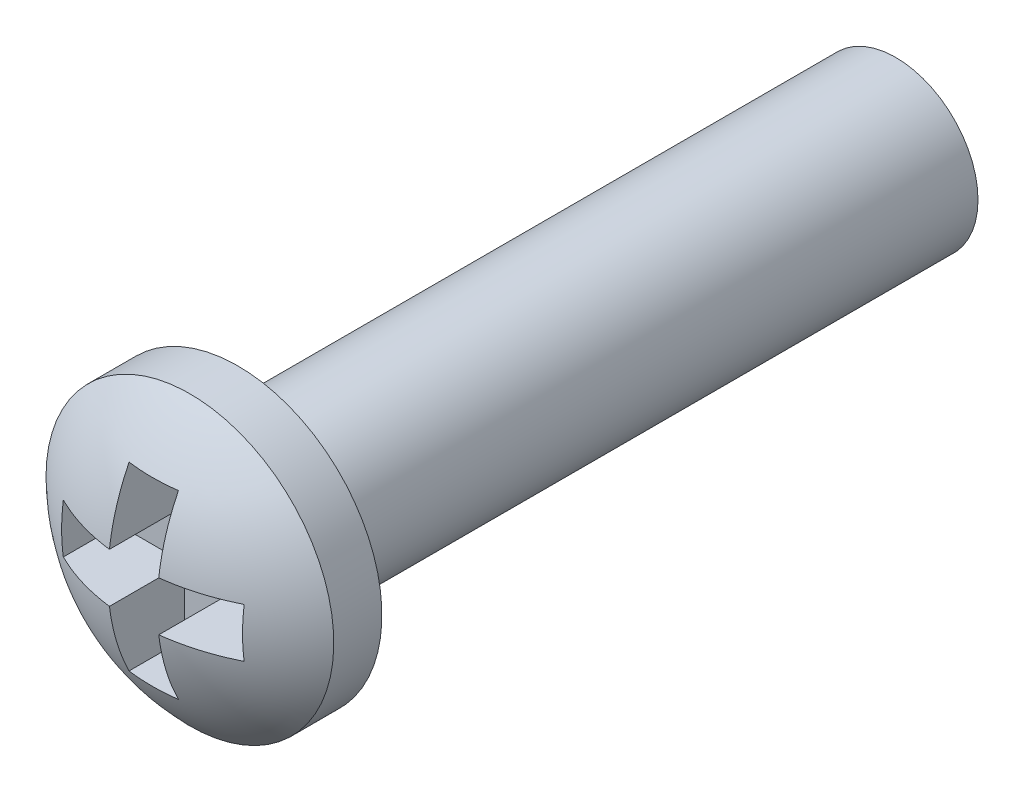
ISO-10303-21;
HEADER;
FILE_DESCRIPTION(('STEP AP214'),'2;1');
FILE_NAME('part.step','',(''),(''),'','','');
FILE_SCHEMA(('AUTOMOTIVE_DESIGN { 1 0 10303 214 1 1 1 1 }'));
ENDSEC;
DATA;
#1=APPLICATION_CONTEXT('core data for automotive mechanical design processes');
#2=APPLICATION_PROTOCOL_DEFINITION('international standard','automotive_design',2000,#1);
#3=PRODUCT_CONTEXT('',#1,'mechanical');
#4=PRODUCT('Part','Part','',(#3));
#5=PRODUCT_RELATED_PRODUCT_CATEGORY('part','',(#4));
#6=PRODUCT_DEFINITION_FORMATION('','',#4);
#7=PRODUCT_DEFINITION_CONTEXT('part definition',#1,'design');
#8=PRODUCT_DEFINITION('design','',#6,#7);
#9=PRODUCT_DEFINITION_SHAPE('','',#8);
#10=(LENGTH_UNIT() NAMED_UNIT(*) SI_UNIT(.MILLI.,.METRE.));
#11=(NAMED_UNIT(*) PLANE_ANGLE_UNIT() SI_UNIT($,.RADIAN.));
#12=(NAMED_UNIT(*) SI_UNIT($,.STERADIAN.) SOLID_ANGLE_UNIT());
#13=UNCERTAINTY_MEASURE_WITH_UNIT(LENGTH_MEASURE(1.E-05),#10,'distance_accuracy_value','');
#14=(GEOMETRIC_REPRESENTATION_CONTEXT(3) GLOBAL_UNCERTAINTY_ASSIGNED_CONTEXT((#13)) GLOBAL_UNIT_ASSIGNED_CONTEXT((#10,
#11,#12)) REPRESENTATION_CONTEXT('',''));
#15=CARTESIAN_POINT('',(0.,0.,0.));
#16=DIRECTION('',(0.,0.,1.));
#17=DIRECTION('',(1.,0.,0.));
#18=AXIS2_PLACEMENT_3D('',#15,#16,#17);
#19=CARTESIAN_POINT('',(0.,0.,-8.));
#20=DIRECTION('',(0.,0.,1.));
#21=DIRECTION('',(1.,0.,0.));
#22=AXIS2_PLACEMENT_3D('',#19,#20,#21);
#23=CYLINDRICAL_SURFACE('',#22,1.);
#24=CARTESIAN_POINT('',(0.,0.,-8.));
#25=DIRECTION('',(0.,0.,1.));
#26=DIRECTION('',(1.,0.,0.));
#27=AXIS2_PLACEMENT_3D('',#24,#25,#26);
#28=CIRCLE('',#27,1.);
#29=CARTESIAN_POINT('',(1.,0.,-8.));
#30=VERTEX_POINT('',#29);
#31=EDGE_CURVE('E212',#30,#30,#28,.T.);
#32=ORIENTED_EDGE('',*,*,#31,.T.);
#33=EDGE_LOOP('',(#32));
#34=FACE_BOUND('',#33,.T.);
#35=CARTESIAN_POINT('',(0.,0.,0.));
#36=DIRECTION('',(0.,0.,1.));
#37=DIRECTION('',(1.,0.,0.));
#38=AXIS2_PLACEMENT_3D('',#35,#36,#37);
#39=CIRCLE('',#38,1.);
#40=CARTESIAN_POINT('',(1.,0.,0.));
#41=VERTEX_POINT('',#40);
#42=EDGE_CURVE('E208',#41,#41,#39,.T.);
#43=ORIENTED_EDGE('',*,*,#42,.F.);
#44=EDGE_LOOP('',(#43));
#45=FACE_BOUND('',#44,.T.);
#46=ADVANCED_FACE('F41',(#34,#45),#23,.T.);
#47=CARTESIAN_POINT('',(0.,0.,-8.));
#48=DIRECTION('',(0.,0.,1.));
#49=DIRECTION('',(1.,0.,0.));
#50=AXIS2_PLACEMENT_3D('',#47,#48,#49);
#51=PLANE('',#50);
#52=ORIENTED_EDGE('',*,*,#31,.F.);
#53=EDGE_LOOP('',(#52));
#54=FACE_BOUND('',#53,.T.);
#55=ADVANCED_FACE('F281',(#54),#51,.F.);
#56=CARTESIAN_POINT('',(0.,0.,0.));
#57=DIRECTION('',(0.,0.,1.));
#58=DIRECTION('',(1.,0.,0.));
#59=AXIS2_PLACEMENT_3D('',#56,#57,#58);
#60=PLANE('',#59);
#61=ORIENTED_EDGE('',*,*,#42,.T.);
#62=EDGE_LOOP('',(#61));
#63=FACE_BOUND('',#62,.T.);
#64=CARTESIAN_POINT('',(0.,0.,0.));
#65=DIRECTION('',(0.,0.,-1.));
#66=DIRECTION('',(-1.,0.,0.));
#67=AXIS2_PLACEMENT_3D('',#64,#65,#66);
#68=CIRCLE('',#67,1.75);
#69=CARTESIAN_POINT('',(-1.75,0.,0.));
#70=VERTEX_POINT('',#69);
#71=EDGE_CURVE('E210',#70,#70,#68,.T.);
#72=ORIENTED_EDGE('',*,*,#71,.T.);
#73=EDGE_LOOP('',(#72));
#74=FACE_BOUND('',#73,.T.);
#75=ADVANCED_FACE('F286',(#63,#74),#60,.F.);
#76=CARTESIAN_POINT('',(0.,0.,-2.));
#77=DIRECTION('',(0.,0.,-1.));
#78=DIRECTION('',(-1.,0.,0.));
#79=AXIS2_PLACEMENT_3D('',#76,#77,#78);
#80=CYLINDRICAL_SURFACE('',#79,1.75);
#81=ORIENTED_EDGE('',*,*,#71,.F.);
#82=EDGE_LOOP('',(#81));
#83=FACE_BOUND('',#82,.T.);
#84=CARTESIAN_POINT('',(0.,0.,0.585357107135713));
#85=DIRECTION('',(0.,0.,-1.));
#86=DIRECTION('',(-1.,0.,0.));
#87=AXIS2_PLACEMENT_3D('',#84,#85,#86);
#88=CIRCLE('',#87,1.75);
#89=CARTESIAN_POINT('',(-1.75,0.,0.585357107135713));
#90=VERTEX_POINT('',#89);
#91=EDGE_CURVE('E179',#90,#90,#88,.T.);
#92=ORIENTED_EDGE('',*,*,#91,.T.);
#93=EDGE_LOOP('',(#92));
#94=FACE_BOUND('',#93,.T.);
#95=ADVANCED_FACE('F300',(#83,#94),#80,.T.);
#96=CARTESIAN_POINT('',(0.,0.,-1.2));
#97=DIRECTION('',(0.,0.,-1.));
#98=DIRECTION('',(1.,0.,0.));
#99=AXIS2_PLACEMENT_3D('',#96,#97,#98);
#100=SPHERICAL_SURFACE('',#99,2.5);
#101=CARTESIAN_POINT('',(0.,-1.1,-1.2));
#102=DIRECTION('',(0.,-1.,0.));
#103=DIRECTION('',(0.,0.,-1.));
#104=AXIS2_PLACEMENT_3D('',#101,#102,#103);
#105=CIRCLE('',#104,2.24499443206437);
#106=CARTESIAN_POINT('',(0.3,-1.1,1.0248595461287));
#107=VERTEX_POINT('',#106);
#108=CARTESIAN_POINT('',(-0.3,-1.1,1.0248595461287));
#109=VERTEX_POINT('',#108);
#110=EDGE_CURVE('E211',#107,#109,#105,.T.);
#111=ORIENTED_EDGE('',*,*,#110,.T.);
#112=CARTESIAN_POINT('',(-0.3,0.,-1.2));
#113=DIRECTION('',(-1.,0.,0.));
#114=DIRECTION('',(0.,0.,1.));
#115=AXIS2_PLACEMENT_3D('',#112,#113,#114);
#116=CIRCLE('',#115,2.48193472919818);
#117=CARTESIAN_POINT('',(-0.3,-0.3,1.26373699895098));
#118=VERTEX_POINT('',#117);
#119=EDGE_CURVE('E11',#109,#118,#116,.T.);
#120=ORIENTED_EDGE('',*,*,#119,.T.);
#121=CARTESIAN_POINT('',(0.,-0.3,-1.2));
#122=DIRECTION('',(0.,-1.,0.));
#123=DIRECTION('',(0.,0.,-1.));
#124=AXIS2_PLACEMENT_3D('',#121,#122,#123);
#125=CIRCLE('',#124,2.48193472919818);
#126=CARTESIAN_POINT('',(-1.1,-0.3,1.0248595461287));
#127=VERTEX_POINT('',#126);
#128=EDGE_CURVE('E48',#118,#127,#125,.T.);
#129=ORIENTED_EDGE('',*,*,#128,.T.);
#130=CARTESIAN_POINT('',(-1.1,0.,-1.2));
#131=DIRECTION('',(-1.,0.,0.));
#132=DIRECTION('',(0.,0.,1.));
#133=AXIS2_PLACEMENT_3D('',#130,#131,#132);
#134=CIRCLE('',#133,2.24499443206437);
#135=CARTESIAN_POINT('',(-1.1,0.3,1.0248595461287));
#136=VERTEX_POINT('',#135);
#137=EDGE_CURVE('E245',#127,#136,#134,.T.);
#138=ORIENTED_EDGE('',*,*,#137,.T.);
#139=CARTESIAN_POINT('',(0.,0.3,-1.2));
#140=DIRECTION('',(0.,1.,0.));
#141=DIRECTION('',(0.,0.,1.));
#142=AXIS2_PLACEMENT_3D('',#139,#140,#141);
#143=CIRCLE('',#142,2.48193472919818);
#144=CARTESIAN_POINT('',(-0.3,0.3,1.26373699895098));
#145=VERTEX_POINT('',#144);
#146=EDGE_CURVE('E236',#136,#145,#143,.T.);
#147=ORIENTED_EDGE('',*,*,#146,.T.);
#148=CARTESIAN_POINT('',(-0.3,0.,-1.2));
#149=DIRECTION('',(-1.,0.,0.));
#150=DIRECTION('',(0.,0.,1.));
#151=AXIS2_PLACEMENT_3D('',#148,#149,#150);
#152=CIRCLE('',#151,2.48193472919818);
#153=CARTESIAN_POINT('',(-0.3,1.1,1.0248595461287));
#154=VERTEX_POINT('',#153);
#155=EDGE_CURVE('E237',#145,#154,#152,.T.);
#156=ORIENTED_EDGE('',*,*,#155,.T.);
#157=CARTESIAN_POINT('',(0.,1.1,-1.2));
#158=DIRECTION('',(0.,1.,0.));
#159=DIRECTION('',(0.,0.,1.));
#160=AXIS2_PLACEMENT_3D('',#157,#158,#159);
#161=CIRCLE('',#160,2.24499443206437);
#162=CARTESIAN_POINT('',(0.3,1.1,1.0248595461287));
#163=VERTEX_POINT('',#162);
#164=EDGE_CURVE('E231',#154,#163,#161,.T.);
#165=ORIENTED_EDGE('',*,*,#164,.T.);
#166=CARTESIAN_POINT('',(0.3,0.,-1.2));
#167=DIRECTION('',(1.,0.,0.));
#168=DIRECTION('',(0.,0.,-1.));
#169=AXIS2_PLACEMENT_3D('',#166,#167,#168);
#170=CIRCLE('',#169,2.48193472919818);
#171=CARTESIAN_POINT('',(0.3,0.3,1.26373699895098));
#172=VERTEX_POINT('',#171);
#173=EDGE_CURVE('E226',#163,#172,#170,.T.);
#174=ORIENTED_EDGE('',*,*,#173,.T.);
#175=CARTESIAN_POINT('',(0.,0.3,-1.2));
#176=DIRECTION('',(0.,1.,0.));
#177=DIRECTION('',(0.,0.,1.));
#178=AXIS2_PLACEMENT_3D('',#175,#176,#177);
#179=CIRCLE('',#178,2.48193472919818);
#180=CARTESIAN_POINT('',(1.1,0.3,1.0248595461287));
#181=VERTEX_POINT('',#180);
#182=EDGE_CURVE('E229',#172,#181,#179,.T.);
#183=ORIENTED_EDGE('',*,*,#182,.T.);
#184=CARTESIAN_POINT('',(1.1,0.,-1.2));
#185=DIRECTION('',(1.,0.,0.));
#186=DIRECTION('',(0.,0.,-1.));
#187=AXIS2_PLACEMENT_3D('',#184,#185,#186);
#188=CIRCLE('',#187,2.24499443206437);
#189=CARTESIAN_POINT('',(1.1,-0.3,1.0248595461287));
#190=VERTEX_POINT('',#189);
#191=EDGE_CURVE('E221',#181,#190,#188,.T.);
#192=ORIENTED_EDGE('',*,*,#191,.T.);
#193=CARTESIAN_POINT('',(0.,-0.3,-1.2));
#194=DIRECTION('',(0.,-1.,0.));
#195=DIRECTION('',(0.,0.,-1.));
#196=AXIS2_PLACEMENT_3D('',#193,#194,#195);
#197=CIRCLE('',#196,2.48193472919818);
#198=CARTESIAN_POINT('',(0.3,-0.3,1.26373699895098));
#199=VERTEX_POINT('',#198);
#200=EDGE_CURVE('E222',#190,#199,#197,.T.);
#201=ORIENTED_EDGE('',*,*,#200,.T.);
#202=CARTESIAN_POINT('',(0.3,0.,-1.2));
#203=DIRECTION('',(1.,0.,0.));
#204=DIRECTION('',(0.,0.,-1.));
#205=AXIS2_PLACEMENT_3D('',#202,#203,#204);
#206=CIRCLE('',#205,2.48193472919818);
#207=EDGE_CURVE('E219',#199,#107,#206,.T.);
#208=ORIENTED_EDGE('',*,*,#207,.T.);
#209=EDGE_LOOP('',(#111,#120,#129,#138,#147,#156,#165,#174,#183,#192,#201,#208));
#210=FACE_BOUND('',#209,.T.);
#211=ORIENTED_EDGE('',*,*,#91,.F.);
#212=EDGE_LOOP('',(#211));
#213=FACE_BOUND('',#212,.T.);
#214=ADVANCED_FACE('F243',(#210,#213),#100,.T.);
#215=CARTESIAN_POINT('',(-0.3,-0.3,0.35));
#216=DIRECTION('',(-1.,0.,0.));
#217=DIRECTION('',(0.,0.,1.));
#218=AXIS2_PLACEMENT_3D('',#215,#216,#217);
#219=PLANE('',#218);
#220=DIRECTION('',(0.,0.,1.));
#221=VECTOR('',#220,1.);
#222=CARTESIAN_POINT('',(-0.3,-1.1,0.35));
#223=LINE('',#222,#221);
#224=CARTESIAN_POINT('',(-0.3,-1.1,0.35));
#225=VERTEX_POINT('',#224);
#226=EDGE_CURVE('E54',#225,#109,#223,.T.);
#227=ORIENTED_EDGE('',*,*,#226,.F.);
#228=DIRECTION('',(0.,-1.,0.));
#229=VECTOR('',#228,1.);
#230=CARTESIAN_POINT('',(-0.3,-0.3,0.35));
#231=LINE('',#230,#229);
#232=CARTESIAN_POINT('',(-0.3,-0.3,0.35));
#233=VERTEX_POINT('',#232);
#234=EDGE_CURVE('E129',#233,#225,#231,.T.);
#235=ORIENTED_EDGE('',*,*,#234,.F.);
#236=DIRECTION('',(0.,0.,1.));
#237=VECTOR('',#236,1.);
#238=CARTESIAN_POINT('',(-0.3,-0.3,0.35));
#239=LINE('',#238,#237);
#240=EDGE_CURVE('E173',#233,#118,#239,.T.);
#241=ORIENTED_EDGE('',*,*,#240,.T.);
#242=ORIENTED_EDGE('',*,*,#119,.F.);
#243=EDGE_LOOP('',(#227,#235,#241,#242));
#244=FACE_BOUND('',#243,.T.);
#245=ADVANCED_FACE('F127',(#244),#219,.F.);
#246=CARTESIAN_POINT('',(-1.1,-0.3,0.35));
#247=DIRECTION('',(0.,-1.,0.));
#248=DIRECTION('',(0.,0.,-1.));
#249=AXIS2_PLACEMENT_3D('',#246,#247,#248);
#250=PLANE('',#249);
#251=ORIENTED_EDGE('',*,*,#240,.F.);
#252=DIRECTION('',(1.,0.,0.));
#253=VECTOR('',#252,1.);
#254=CARTESIAN_POINT('',(-1.1,-0.3,0.35));
#255=LINE('',#254,#253);
#256=CARTESIAN_POINT('',(-1.1,-0.3,0.35));
#257=VERTEX_POINT('',#256);
#258=EDGE_CURVE('E131',#257,#233,#255,.T.);
#259=ORIENTED_EDGE('',*,*,#258,.F.);
#260=DIRECTION('',(0.,0.,1.));
#261=VECTOR('',#260,1.);
#262=CARTESIAN_POINT('',(-1.1,-0.3,0.35));
#263=LINE('',#262,#261);
#264=EDGE_CURVE('E177',#257,#127,#263,.T.);
#265=ORIENTED_EDGE('',*,*,#264,.T.);
#266=ORIENTED_EDGE('',*,*,#128,.F.);
#267=EDGE_LOOP('',(#251,#259,#265,#266));
#268=FACE_BOUND('',#267,.T.);
#269=ADVANCED_FACE('F273',(#268),#250,.F.);
#270=CARTESIAN_POINT('',(-1.1,0.3,0.35));
#271=DIRECTION('',(-1.,0.,0.));
#272=DIRECTION('',(0.,0.,1.));
#273=AXIS2_PLACEMENT_3D('',#270,#271,#272);
#274=PLANE('',#273);
#275=ORIENTED_EDGE('',*,*,#264,.F.);
#276=DIRECTION('',(0.,-1.,0.));
#277=VECTOR('',#276,1.);
#278=CARTESIAN_POINT('',(-1.1,0.3,0.35));
#279=LINE('',#278,#277);
#280=CARTESIAN_POINT('',(-1.1,0.3,0.35));
#281=VERTEX_POINT('',#280);
#282=EDGE_CURVE('E175',#281,#257,#279,.T.);
#283=ORIENTED_EDGE('',*,*,#282,.F.);
#284=DIRECTION('',(0.,0.,1.));
#285=VECTOR('',#284,1.);
#286=CARTESIAN_POINT('',(-1.1,0.3,0.35));
#287=LINE('',#286,#285);
#288=EDGE_CURVE('E176',#281,#136,#287,.T.);
#289=ORIENTED_EDGE('',*,*,#288,.T.);
#290=ORIENTED_EDGE('',*,*,#137,.F.);
#291=EDGE_LOOP('',(#275,#283,#289,#290));
#292=FACE_BOUND('',#291,.T.);
#293=ADVANCED_FACE('F275',(#292),#274,.F.);
#294=CARTESIAN_POINT('',(-0.3,0.3,0.35));
#295=DIRECTION('',(0.,1.,0.));
#296=DIRECTION('',(0.,0.,1.));
#297=AXIS2_PLACEMENT_3D('',#294,#295,#296);
#298=PLANE('',#297);
#299=ORIENTED_EDGE('',*,*,#288,.F.);
#300=DIRECTION('',(-1.,0.,0.));
#301=VECTOR('',#300,1.);
#302=CARTESIAN_POINT('',(-0.3,0.3,0.35));
#303=LINE('',#302,#301);
#304=CARTESIAN_POINT('',(-0.3,0.3,0.35));
#305=VERTEX_POINT('',#304);
#306=EDGE_CURVE('E166',#305,#281,#303,.T.);
#307=ORIENTED_EDGE('',*,*,#306,.F.);
#308=DIRECTION('',(0.,0.,1.));
#309=VECTOR('',#308,1.);
#310=CARTESIAN_POINT('',(-0.3,0.3,0.35));
#311=LINE('',#310,#309);
#312=EDGE_CURVE('E181',#305,#145,#311,.T.);
#313=ORIENTED_EDGE('',*,*,#312,.T.);
#314=ORIENTED_EDGE('',*,*,#146,.F.);
#315=EDGE_LOOP('',(#299,#307,#313,#314));
#316=FACE_BOUND('',#315,.T.);
#317=ADVANCED_FACE('F269',(#316),#298,.F.);
#318=CARTESIAN_POINT('',(-0.3,1.1,0.35));
#319=DIRECTION('',(-1.,0.,0.));
#320=DIRECTION('',(0.,0.,1.));
#321=AXIS2_PLACEMENT_3D('',#318,#319,#320);
#322=PLANE('',#321);
#323=ORIENTED_EDGE('',*,*,#312,.F.);
#324=DIRECTION('',(0.,-1.,0.));
#325=VECTOR('',#324,1.);
#326=CARTESIAN_POINT('',(-0.3,1.1,0.35));
#327=LINE('',#326,#325);
#328=CARTESIAN_POINT('',(-0.3,1.1,0.35));
#329=VERTEX_POINT('',#328);
#330=EDGE_CURVE('E167',#329,#305,#327,.T.);
#331=ORIENTED_EDGE('',*,*,#330,.F.);
#332=DIRECTION('',(0.,0.,1.));
#333=VECTOR('',#332,1.);
#334=CARTESIAN_POINT('',(-0.3,1.1,0.35));
#335=LINE('',#334,#333);
#336=EDGE_CURVE('E188',#329,#154,#335,.T.);
#337=ORIENTED_EDGE('',*,*,#336,.T.);
#338=ORIENTED_EDGE('',*,*,#155,.F.);
#339=EDGE_LOOP('',(#323,#331,#337,#338));
#340=FACE_BOUND('',#339,.T.);
#341=ADVANCED_FACE('F266',(#340),#322,.F.);
#342=CARTESIAN_POINT('',(0.3,1.1,0.35));
#343=DIRECTION('',(0.,1.,0.));
#344=DIRECTION('',(0.,0.,1.));
#345=AXIS2_PLACEMENT_3D('',#342,#343,#344);
#346=PLANE('',#345);
#347=ORIENTED_EDGE('',*,*,#336,.F.);
#348=DIRECTION('',(-1.,0.,0.));
#349=VECTOR('',#348,1.);
#350=CARTESIAN_POINT('',(0.3,1.1,0.35));
#351=LINE('',#350,#349);
#352=CARTESIAN_POINT('',(0.3,1.1,0.35));
#353=VERTEX_POINT('',#352);
#354=EDGE_CURVE('E164',#353,#329,#351,.T.);
#355=ORIENTED_EDGE('',*,*,#354,.F.);
#356=DIRECTION('',(0.,0.,1.));
#357=VECTOR('',#356,1.);
#358=CARTESIAN_POINT('',(0.3,1.1,0.35));
#359=LINE('',#358,#357);
#360=EDGE_CURVE('E189',#353,#163,#359,.T.);
#361=ORIENTED_EDGE('',*,*,#360,.T.);
#362=ORIENTED_EDGE('',*,*,#164,.F.);
#363=EDGE_LOOP('',(#347,#355,#361,#362));
#364=FACE_BOUND('',#363,.T.);
#365=ADVANCED_FACE('F261',(#364),#346,.F.);
#366=CARTESIAN_POINT('',(0.3,0.3,0.35));
#367=DIRECTION('',(1.,0.,0.));
#368=DIRECTION('',(0.,0.,-1.));
#369=AXIS2_PLACEMENT_3D('',#366,#367,#368);
#370=PLANE('',#369);
#371=ORIENTED_EDGE('',*,*,#360,.F.);
#372=DIRECTION('',(0.,1.,0.));
#373=VECTOR('',#372,1.);
#374=CARTESIAN_POINT('',(0.3,0.3,0.35));
#375=LINE('',#374,#373);
#376=CARTESIAN_POINT('',(0.3,0.3,0.35));
#377=VERTEX_POINT('',#376);
#378=EDGE_CURVE('E158',#377,#353,#375,.T.);
#379=ORIENTED_EDGE('',*,*,#378,.F.);
#380=DIRECTION('',(0.,0.,1.));
#381=VECTOR('',#380,1.);
#382=CARTESIAN_POINT('',(0.3,0.3,0.35));
#383=LINE('',#382,#381);
#384=EDGE_CURVE('E195',#377,#172,#383,.T.);
#385=ORIENTED_EDGE('',*,*,#384,.T.);
#386=ORIENTED_EDGE('',*,*,#173,.F.);
#387=EDGE_LOOP('',(#371,#379,#385,#386));
#388=FACE_BOUND('',#387,.T.);
#389=ADVANCED_FACE('F263',(#388),#370,.F.);
#390=CARTESIAN_POINT('',(1.1,0.3,0.35));
#391=DIRECTION('',(0.,1.,0.));
#392=DIRECTION('',(0.,0.,1.));
#393=AXIS2_PLACEMENT_3D('',#390,#391,#392);
#394=PLANE('',#393);
#395=ORIENTED_EDGE('',*,*,#384,.F.);
#396=DIRECTION('',(-1.,0.,0.));
#397=VECTOR('',#396,1.);
#398=CARTESIAN_POINT('',(1.1,0.3,0.35));
#399=LINE('',#398,#397);
#400=CARTESIAN_POINT('',(1.1,0.3,0.35));
#401=VERTEX_POINT('',#400);
#402=EDGE_CURVE('E160',#401,#377,#399,.T.);
#403=ORIENTED_EDGE('',*,*,#402,.F.);
#404=DIRECTION('',(0.,0.,1.));
#405=VECTOR('',#404,1.);
#406=CARTESIAN_POINT('',(1.1,0.3,0.35));
#407=LINE('',#406,#405);
#408=EDGE_CURVE('E194',#401,#181,#407,.T.);
#409=ORIENTED_EDGE('',*,*,#408,.T.);
#410=ORIENTED_EDGE('',*,*,#182,.F.);
#411=EDGE_LOOP('',(#395,#403,#409,#410));
#412=FACE_BOUND('',#411,.T.);
#413=ADVANCED_FACE('F257',(#412),#394,.F.);
#414=CARTESIAN_POINT('',(1.1,-0.3,0.35));
#415=DIRECTION('',(1.,0.,0.));
#416=DIRECTION('',(0.,0.,-1.));
#417=AXIS2_PLACEMENT_3D('',#414,#415,#416);
#418=PLANE('',#417);
#419=ORIENTED_EDGE('',*,*,#408,.F.);
#420=DIRECTION('',(0.,1.,0.));
#421=VECTOR('',#420,1.);
#422=CARTESIAN_POINT('',(1.1,-0.3,0.35));
#423=LINE('',#422,#421);
#424=CARTESIAN_POINT('',(1.1,-0.3,0.35));
#425=VERTEX_POINT('',#424);
#426=EDGE_CURVE('E155',#425,#401,#423,.T.);
#427=ORIENTED_EDGE('',*,*,#426,.F.);
#428=DIRECTION('',(0.,0.,1.));
#429=VECTOR('',#428,1.);
#430=CARTESIAN_POINT('',(1.1,-0.3,0.35));
#431=LINE('',#430,#429);
#432=EDGE_CURVE('E198',#425,#190,#431,.T.);
#433=ORIENTED_EDGE('',*,*,#432,.T.);
#434=ORIENTED_EDGE('',*,*,#191,.F.);
#435=EDGE_LOOP('',(#419,#427,#433,#434));
#436=FACE_BOUND('',#435,.T.);
#437=ADVANCED_FACE('F255',(#436),#418,.F.);
#438=CARTESIAN_POINT('',(0.3,-0.3,0.35));
#439=DIRECTION('',(0.,-1.,0.));
#440=DIRECTION('',(0.,0.,-1.));
#441=AXIS2_PLACEMENT_3D('',#438,#439,#440);
#442=PLANE('',#441);
#443=ORIENTED_EDGE('',*,*,#432,.F.);
#444=DIRECTION('',(1.,0.,0.));
#445=VECTOR('',#444,1.);
#446=CARTESIAN_POINT('',(0.3,-0.3,0.35));
#447=LINE('',#446,#445);
#448=CARTESIAN_POINT('',(0.3,-0.3,0.35));
#449=VERTEX_POINT('',#448);
#450=EDGE_CURVE('E153',#449,#425,#447,.T.);
#451=ORIENTED_EDGE('',*,*,#450,.F.);
#452=DIRECTION('',(0.,0.,1.));
#453=VECTOR('',#452,1.);
#454=CARTESIAN_POINT('',(0.3,-0.3,0.35));
#455=LINE('',#454,#453);
#456=EDGE_CURVE('E201',#449,#199,#455,.T.);
#457=ORIENTED_EDGE('',*,*,#456,.T.);
#458=ORIENTED_EDGE('',*,*,#200,.F.);
#459=EDGE_LOOP('',(#443,#451,#457,#458));
#460=FACE_BOUND('',#459,.T.);
#461=ADVANCED_FACE('F254',(#460),#442,.F.);
#462=CARTESIAN_POINT('',(0.3,-1.1,0.35));
#463=DIRECTION('',(1.,0.,0.));
#464=DIRECTION('',(0.,0.,-1.));
#465=AXIS2_PLACEMENT_3D('',#462,#463,#464);
#466=PLANE('',#465);
#467=ORIENTED_EDGE('',*,*,#456,.F.);
#468=DIRECTION('',(0.,1.,0.));
#469=VECTOR('',#468,1.);
#470=CARTESIAN_POINT('',(0.3,-1.1,0.35));
#471=LINE('',#470,#469);
#472=CARTESIAN_POINT('',(0.3,-1.1,0.35));
#473=VERTEX_POINT('',#472);
#474=EDGE_CURVE('E144',#473,#449,#471,.T.);
#475=ORIENTED_EDGE('',*,*,#474,.F.);
#476=DIRECTION('',(0.,0.,1.));
#477=VECTOR('',#476,1.);
#478=CARTESIAN_POINT('',(0.3,-1.1,0.35));
#479=LINE('',#478,#477);
#480=EDGE_CURVE('E134',#473,#107,#479,.T.);
#481=ORIENTED_EDGE('',*,*,#480,.T.);
#482=ORIENTED_EDGE('',*,*,#207,.F.);
#483=EDGE_LOOP('',(#467,#475,#481,#482));
#484=FACE_BOUND('',#483,.T.);
#485=ADVANCED_FACE('F249',(#484),#466,.F.);
#486=CARTESIAN_POINT('',(-0.3,-1.1,0.35));
#487=DIRECTION('',(0.,-1.,0.));
#488=DIRECTION('',(0.,0.,-1.));
#489=AXIS2_PLACEMENT_3D('',#486,#487,#488);
#490=PLANE('',#489);
#491=ORIENTED_EDGE('',*,*,#480,.F.);
#492=DIRECTION('',(1.,0.,0.));
#493=VECTOR('',#492,1.);
#494=CARTESIAN_POINT('',(-0.3,-1.1,0.35));
#495=LINE('',#494,#493);
#496=EDGE_CURVE('E140',#225,#473,#495,.T.);
#497=ORIENTED_EDGE('',*,*,#496,.F.);
#498=ORIENTED_EDGE('',*,*,#226,.T.);
#499=ORIENTED_EDGE('',*,*,#110,.F.);
#500=EDGE_LOOP('',(#491,#497,#498,#499));
#501=FACE_BOUND('',#500,.T.);
#502=ADVANCED_FACE('F139',(#501),#490,.F.);
#503=CARTESIAN_POINT('',(0.,0.,0.35));
#504=DIRECTION('',(0.,0.,1.));
#505=DIRECTION('',(1.,0.,0.));
#506=AXIS2_PLACEMENT_3D('',#503,#504,#505);
#507=PLANE('',#506);
#508=ORIENTED_EDGE('',*,*,#234,.T.);
#509=ORIENTED_EDGE('',*,*,#496,.T.);
#510=ORIENTED_EDGE('',*,*,#474,.T.);
#511=ORIENTED_EDGE('',*,*,#450,.T.);
#512=ORIENTED_EDGE('',*,*,#426,.T.);
#513=ORIENTED_EDGE('',*,*,#402,.T.);
#514=ORIENTED_EDGE('',*,*,#378,.T.);
#515=ORIENTED_EDGE('',*,*,#354,.T.);
#516=ORIENTED_EDGE('',*,*,#330,.T.);
#517=ORIENTED_EDGE('',*,*,#306,.T.);
#518=ORIENTED_EDGE('',*,*,#282,.T.);
#519=ORIENTED_EDGE('',*,*,#258,.T.);
#520=EDGE_LOOP('',(#508,#509,#510,#511,#512,#513,#514,#515,#516,#517,#518,#519));
#521=FACE_BOUND('',#520,.T.);
#522=ADVANCED_FACE('F143',(#521),#507,.T.);
#523=CLOSED_SHELL('',(#46,#55,#75,#95,#214,#245,#269,#293,#317,#341,#365,#389,#413,#437,#461,
#485,#502,#522));
#524=MANIFOLD_SOLID_BREP('B2',#523);
#525=ADVANCED_BREP_SHAPE_REPRESENTATION('',(#18,#524),#14);
#526=SHAPE_DEFINITION_REPRESENTATION(#9,#525);
ENDSEC;
END-ISO-10303-21;
